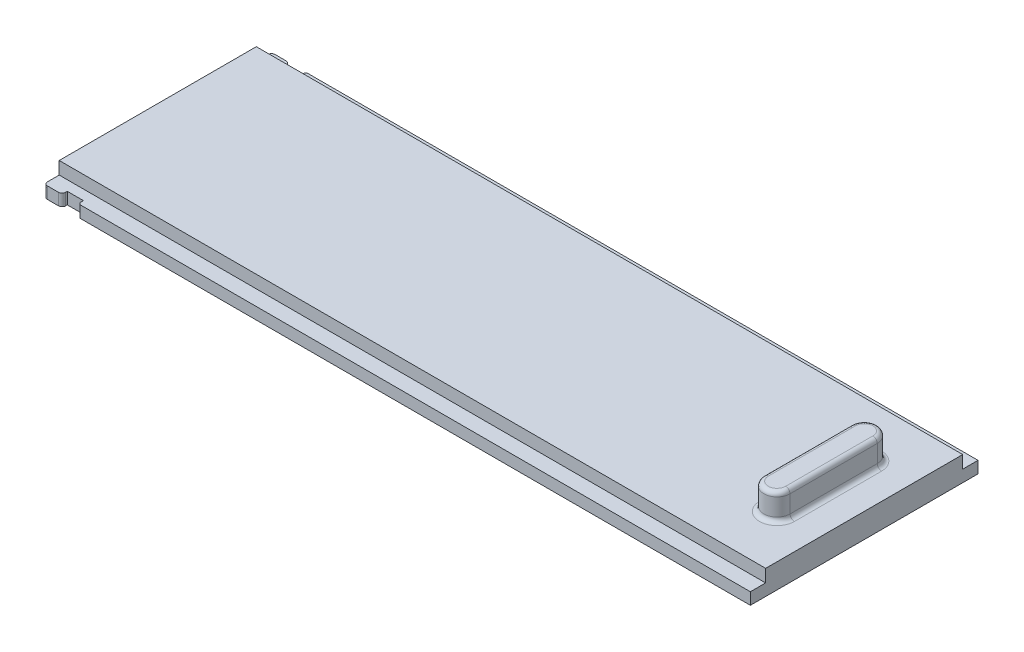
ISO-10303-21;
HEADER;
FILE_DESCRIPTION(('STEP AP214'),'2;1');
FILE_NAME('part.step','',(''),(''),'','','');
FILE_SCHEMA(('AUTOMOTIVE_DESIGN { 1 0 10303 214 1 1 1 1 }'));
ENDSEC;
DATA;
#1=APPLICATION_CONTEXT('core data for automotive mechanical design processes');
#2=APPLICATION_PROTOCOL_DEFINITION('international standard','automotive_design',2000,#1);
#3=PRODUCT_CONTEXT('',#1,'mechanical');
#4=PRODUCT('Part','Part','',(#3));
#5=PRODUCT_RELATED_PRODUCT_CATEGORY('part','',(#4));
#6=PRODUCT_DEFINITION_FORMATION('','',#4);
#7=PRODUCT_DEFINITION_CONTEXT('part definition',#1,'design');
#8=PRODUCT_DEFINITION('design','',#6,#7);
#9=PRODUCT_DEFINITION_SHAPE('','',#8);
#10=(LENGTH_UNIT() NAMED_UNIT(*) SI_UNIT(.MILLI.,.METRE.));
#11=(NAMED_UNIT(*) PLANE_ANGLE_UNIT() SI_UNIT($,.RADIAN.));
#12=(NAMED_UNIT(*) SI_UNIT($,.STERADIAN.) SOLID_ANGLE_UNIT());
#13=UNCERTAINTY_MEASURE_WITH_UNIT(LENGTH_MEASURE(1.E-05),#10,'distance_accuracy_value','');
#14=(GEOMETRIC_REPRESENTATION_CONTEXT(3) GLOBAL_UNCERTAINTY_ASSIGNED_CONTEXT((#13)) GLOBAL_UNIT_ASSIGNED_CONTEXT((#10,
#11,#12)) REPRESENTATION_CONTEXT('',''));
#15=CARTESIAN_POINT('',(0.,0.,0.));
#16=DIRECTION('',(0.,0.,1.));
#17=DIRECTION('',(1.,0.,0.));
#18=AXIS2_PLACEMENT_3D('',#15,#16,#17);
#19=CARTESIAN_POINT('',(0.,3.,0.));
#20=DIRECTION('',(0.,-1.,0.));
#21=DIRECTION('',(0.,0.,-1.));
#22=AXIS2_PLACEMENT_3D('',#19,#20,#21);
#23=PLANE('',#22);
#24=CARTESIAN_POINT('',(76.,3.,-9.49999999999999));
#25=DIRECTION('',(0.,-1.,0.));
#26=DIRECTION('',(0.,0.,-1.));
#27=AXIS2_PLACEMENT_3D('',#24,#25,#26);
#28=CIRCLE('',#27,2.);
#29=CARTESIAN_POINT('',(78.,3.,-9.49999999999999));
#30=VERTEX_POINT('',#29);
#31=CARTESIAN_POINT('',(74.,3.,-9.49999999999999));
#32=VERTEX_POINT('',#31);
#33=EDGE_CURVE('E388',#30,#32,#28,.T.);
#34=ORIENTED_EDGE('',*,*,#33,.T.);
#35=DIRECTION('',(0.,0.,1.));
#36=VECTOR('',#35,1.);
#37=CARTESIAN_POINT('',(74.,3.,-19.5));
#38=LINE('',#37,#36);
#39=CARTESIAN_POINT('',(74.,3.,-19.5));
#40=VERTEX_POINT('',#39);
#41=EDGE_CURVE('E394',#32,#40,#38,.F.);
#42=ORIENTED_EDGE('',*,*,#41,.T.);
#43=CARTESIAN_POINT('',(76.,3.,-19.5));
#44=DIRECTION('',(0.,-1.,0.));
#45=DIRECTION('',(0.,0.,-1.));
#46=AXIS2_PLACEMENT_3D('',#43,#44,#45);
#47=CIRCLE('',#46,2.);
#48=CARTESIAN_POINT('',(78.,3.,-19.5));
#49=VERTEX_POINT('',#48);
#50=EDGE_CURVE('E392',#40,#49,#47,.T.);
#51=ORIENTED_EDGE('',*,*,#50,.T.);
#52=DIRECTION('',(0.,0.,-1.));
#53=VECTOR('',#52,1.);
#54=CARTESIAN_POINT('',(78.,3.,-9.49999999999999));
#55=LINE('',#54,#53);
#56=EDGE_CURVE('E390',#49,#30,#55,.F.);
#57=ORIENTED_EDGE('',*,*,#56,.T.);
#58=EDGE_LOOP('',(#34,#42,#51,#57));
#59=FACE_BOUND('',#58,.T.);
#60=DIRECTION('',(0.,0.,-1.));
#61=VECTOR('',#60,1.);
#62=CARTESIAN_POINT('',(81.,3.,0.));
#63=LINE('',#62,#61);
#64=CARTESIAN_POINT('',(81.,3.,-3.2));
#65=VERTEX_POINT('',#64);
#66=CARTESIAN_POINT('',(81.,3.,-25.8));
#67=VERTEX_POINT('',#66);
#68=EDGE_CURVE('E303',#65,#67,#63,.T.);
#69=ORIENTED_EDGE('',*,*,#68,.T.);
#70=DIRECTION('',(1.,0.,0.));
#71=VECTOR('',#70,1.);
#72=CARTESIAN_POINT('',(-3.57805813256297,3.,-25.8));
#73=LINE('',#72,#71);
#74=CARTESIAN_POINT('',(0.,3.,-25.8));
#75=VERTEX_POINT('',#74);
#76=EDGE_CURVE('E267',#75,#67,#73,.T.);
#77=ORIENTED_EDGE('',*,*,#76,.F.);
#78=DIRECTION('',(0.,0.,1.));
#79=VECTOR('',#78,1.);
#80=CARTESIAN_POINT('',(0.,3.,0.));
#81=LINE('',#80,#79);
#82=CARTESIAN_POINT('',(0.,3.,-3.2));
#83=VERTEX_POINT('',#82);
#84=EDGE_CURVE('E300',#75,#83,#81,.T.);
#85=ORIENTED_EDGE('',*,*,#84,.T.);
#86=DIRECTION('',(1.,0.,0.));
#87=VECTOR('',#86,1.);
#88=CARTESIAN_POINT('',(-3.57805813256297,3.,-3.2));
#89=LINE('',#88,#87);
#90=EDGE_CURVE('E286',#83,#65,#89,.T.);
#91=ORIENTED_EDGE('',*,*,#90,.T.);
#92=EDGE_LOOP('',(#69,#77,#85,#91));
#93=FACE_BOUND('',#92,.T.);
#94=ADVANCED_FACE('F41',(#59,#93),#23,.F.);
#95=CARTESIAN_POINT('',(-3.57805813256297,0.,-27.55));
#96=DIRECTION('',(0.,0.,1.));
#97=DIRECTION('',(1.,0.,0.));
#98=AXIS2_PLACEMENT_3D('',#95,#96,#97);
#99=PLANE('',#98);
#100=DIRECTION('',(0.,-1.,0.));
#101=VECTOR('',#100,1.);
#102=CARTESIAN_POINT('',(81.,0.,-27.55));
#103=LINE('',#102,#101);
#104=CARTESIAN_POINT('',(81.,1.55,-27.55));
#105=VERTEX_POINT('',#104);
#106=CARTESIAN_POINT('',(81.,0.2,-27.55));
#107=VERTEX_POINT('',#106);
#108=EDGE_CURVE('E258',#105,#107,#103,.T.);
#109=ORIENTED_EDGE('',*,*,#108,.T.);
#110=DIRECTION('',(1.,0.,0.));
#111=VECTOR('',#110,1.);
#112=CARTESIAN_POINT('',(0.,0.2,-27.55));
#113=LINE('',#112,#111);
#114=CARTESIAN_POINT('',(4.125,0.2,-27.55));
#115=VERTEX_POINT('',#114);
#116=EDGE_CURVE('E239',#115,#107,#113,.T.);
#117=ORIENTED_EDGE('',*,*,#116,.F.);
#118=DIRECTION('',(0.,1.,0.));
#119=VECTOR('',#118,1.);
#120=CARTESIAN_POINT('',(4.125,0.,-27.55));
#121=LINE('',#120,#119);
#122=CARTESIAN_POINT('',(4.125,1.55,-27.55));
#123=VERTEX_POINT('',#122);
#124=EDGE_CURVE('E333',#115,#123,#121,.T.);
#125=ORIENTED_EDGE('',*,*,#124,.T.);
#126=DIRECTION('',(1.,0.,0.));
#127=VECTOR('',#126,1.);
#128=CARTESIAN_POINT('',(-3.57805813256297,1.55,-27.55));
#129=LINE('',#128,#127);
#130=EDGE_CURVE('E265',#123,#105,#129,.T.);
#131=ORIENTED_EDGE('',*,*,#130,.T.);
#132=EDGE_LOOP('',(#109,#117,#125,#131));
#133=FACE_BOUND('',#132,.T.);
#134=ADVANCED_FACE('F263',(#133),#99,.F.);
#135=CARTESIAN_POINT('',(-3.57805813256297,0.,-1.45));
#136=DIRECTION('',(0.,0.,-1.));
#137=DIRECTION('',(0.,1.,0.));
#138=AXIS2_PLACEMENT_3D('',#135,#136,#137);
#139=PLANE('',#138);
#140=DIRECTION('',(0.,-1.,0.));
#141=VECTOR('',#140,1.);
#142=CARTESIAN_POINT('',(4.12500000000001,0.,-1.45));
#143=LINE('',#142,#141);
#144=CARTESIAN_POINT('',(4.12500000000001,1.55,-1.45));
#145=VERTEX_POINT('',#144);
#146=CARTESIAN_POINT('',(4.12500000000001,0.2,-1.45));
#147=VERTEX_POINT('',#146);
#148=EDGE_CURVE('E319',#145,#147,#143,.T.);
#149=ORIENTED_EDGE('',*,*,#148,.T.);
#150=DIRECTION('',(-1.,0.,0.));
#151=VECTOR('',#150,1.);
#152=CARTESIAN_POINT('',(0.,0.2,-1.45));
#153=LINE('',#152,#151);
#154=CARTESIAN_POINT('',(81.,0.2,-1.45));
#155=VERTEX_POINT('',#154);
#156=EDGE_CURVE('E442',#155,#147,#153,.T.);
#157=ORIENTED_EDGE('',*,*,#156,.F.);
#158=DIRECTION('',(0.,1.,0.));
#159=VECTOR('',#158,1.);
#160=CARTESIAN_POINT('',(81.,0.,-1.45));
#161=LINE('',#160,#159);
#162=CARTESIAN_POINT('',(81.,1.55,-1.45));
#163=VERTEX_POINT('',#162);
#164=EDGE_CURVE('E260',#155,#163,#161,.T.);
#165=ORIENTED_EDGE('',*,*,#164,.T.);
#166=DIRECTION('',(1.,0.,0.));
#167=VECTOR('',#166,1.);
#168=CARTESIAN_POINT('',(-3.57805813256297,1.55,-1.45));
#169=LINE('',#168,#167);
#170=EDGE_CURVE('E283',#145,#163,#169,.T.);
#171=ORIENTED_EDGE('',*,*,#170,.F.);
#172=EDGE_LOOP('',(#149,#157,#165,#171));
#173=FACE_BOUND('',#172,.T.);
#174=ADVANCED_FACE('F558',(#173),#139,.F.);
#175=CARTESIAN_POINT('',(0.,3.,0.));
#176=DIRECTION('',(1.,0.,0.));
#177=DIRECTION('',(0.,0.,-1.));
#178=AXIS2_PLACEMENT_3D('',#175,#176,#177);
#179=PLANE('',#178);
#180=DIRECTION('',(0.,0.,1.));
#181=VECTOR('',#180,1.);
#182=CARTESIAN_POINT('',(0.,1.55,-27.55));
#183=LINE('',#182,#181);
#184=CARTESIAN_POINT('',(0.,1.55,-27.15));
#185=VERTEX_POINT('',#184);
#186=CARTESIAN_POINT('',(0.,1.55,-25.8));
#187=VERTEX_POINT('',#186);
#188=EDGE_CURVE('E304',#185,#187,#183,.T.);
#189=ORIENTED_EDGE('',*,*,#188,.F.);
#190=DIRECTION('',(0.,1.,0.));
#191=VECTOR('',#190,1.);
#192=CARTESIAN_POINT('',(0.,3.,-27.15));
#193=LINE('',#192,#191);
#194=CARTESIAN_POINT('',(0.,0.2,-27.15));
#195=VERTEX_POINT('',#194);
#196=EDGE_CURVE('E345',#185,#195,#193,.F.);
#197=ORIENTED_EDGE('',*,*,#196,.T.);
#198=DIRECTION('',(0.,0.,-1.));
#199=VECTOR('',#198,1.);
#200=CARTESIAN_POINT('',(0.,0.2,-27.55));
#201=LINE('',#200,#199);
#202=CARTESIAN_POINT('',(0.,0.2,-1.85000000000001));
#203=VERTEX_POINT('',#202);
#204=EDGE_CURVE('E251',#203,#195,#201,.T.);
#205=ORIENTED_EDGE('',*,*,#204,.F.);
#206=DIRECTION('',(0.,-1.,0.));
#207=VECTOR('',#206,1.);
#208=CARTESIAN_POINT('',(0.,3.,-1.85));
#209=LINE('',#208,#207);
#210=CARTESIAN_POINT('',(0.,1.55,-1.85));
#211=VERTEX_POINT('',#210);
#212=EDGE_CURVE('E343',#203,#211,#209,.F.);
#213=ORIENTED_EDGE('',*,*,#212,.T.);
#214=DIRECTION('',(0.,0.,1.));
#215=VECTOR('',#214,1.);
#216=CARTESIAN_POINT('',(0.,1.55,-1.45));
#217=LINE('',#216,#215);
#218=CARTESIAN_POINT('',(0.,1.55,-3.2));
#219=VERTEX_POINT('',#218);
#220=EDGE_CURVE('E289',#219,#211,#217,.T.);
#221=ORIENTED_EDGE('',*,*,#220,.F.);
#222=DIRECTION('',(0.,-1.,0.));
#223=VECTOR('',#222,1.);
#224=CARTESIAN_POINT('',(0.,1.55,-3.2));
#225=LINE('',#224,#223);
#226=EDGE_CURVE('E295',#83,#219,#225,.T.);
#227=ORIENTED_EDGE('',*,*,#226,.F.);
#228=ORIENTED_EDGE('',*,*,#84,.F.);
#229=DIRECTION('',(0.,1.,0.));
#230=VECTOR('',#229,1.);
#231=CARTESIAN_POINT('',(0.,1.55,-25.8));
#232=LINE('',#231,#230);
#233=EDGE_CURVE('E278',#187,#75,#232,.T.);
#234=ORIENTED_EDGE('',*,*,#233,.F.);
#235=EDGE_LOOP('',(#189,#197,#205,#213,#221,#227,#228,#234));
#236=FACE_BOUND('',#235,.T.);
#237=ADVANCED_FACE('F511',(#236),#179,.F.);
#238=CARTESIAN_POINT('',(81.,3.,0.));
#239=DIRECTION('',(-1.,0.,0.));
#240=DIRECTION('',(0.,0.,1.));
#241=AXIS2_PLACEMENT_3D('',#238,#239,#240);
#242=PLANE('',#241);
#243=ORIENTED_EDGE('',*,*,#164,.F.);
#244=DIRECTION('',(0.,0.,1.));
#245=VECTOR('',#244,1.);
#246=CARTESIAN_POINT('',(81.,0.2,-27.55));
#247=LINE('',#246,#245);
#248=EDGE_CURVE('E243',#107,#155,#247,.T.);
#249=ORIENTED_EDGE('',*,*,#248,.F.);
#250=ORIENTED_EDGE('',*,*,#108,.F.);
#251=DIRECTION('',(0.,0.,-1.));
#252=VECTOR('',#251,1.);
#253=CARTESIAN_POINT('',(81.,1.55,-27.55));
#254=LINE('',#253,#252);
#255=CARTESIAN_POINT('',(81.,1.55,-25.8));
#256=VERTEX_POINT('',#255);
#257=EDGE_CURVE('E268',#256,#105,#254,.T.);
#258=ORIENTED_EDGE('',*,*,#257,.F.);
#259=DIRECTION('',(0.,-1.,0.));
#260=VECTOR('',#259,1.);
#261=CARTESIAN_POINT('',(81.,1.55,-25.8));
#262=LINE('',#261,#260);
#263=EDGE_CURVE('E272',#67,#256,#262,.T.);
#264=ORIENTED_EDGE('',*,*,#263,.F.);
#265=ORIENTED_EDGE('',*,*,#68,.F.);
#266=DIRECTION('',(0.,1.,0.));
#267=VECTOR('',#266,1.);
#268=CARTESIAN_POINT('',(81.,1.55,-3.2));
#269=LINE('',#268,#267);
#270=CARTESIAN_POINT('',(81.,1.55,-3.2));
#271=VERTEX_POINT('',#270);
#272=EDGE_CURVE('E282',#271,#65,#269,.T.);
#273=ORIENTED_EDGE('',*,*,#272,.F.);
#274=DIRECTION('',(0.,0.,-1.));
#275=VECTOR('',#274,1.);
#276=CARTESIAN_POINT('',(81.,1.55,-1.45));
#277=LINE('',#276,#275);
#278=EDGE_CURVE('E291',#163,#271,#277,.T.);
#279=ORIENTED_EDGE('',*,*,#278,.F.);
#280=EDGE_LOOP('',(#243,#249,#250,#258,#264,#265,#273,#279));
#281=FACE_BOUND('',#280,.T.);
#282=ADVANCED_FACE('F256',(#281),#242,.F.);
#283=CARTESIAN_POINT('',(-3.57805813256297,1.55,-3.2));
#284=DIRECTION('',(0.,0.,-1.));
#285=DIRECTION('',(0.,1.,0.));
#286=AXIS2_PLACEMENT_3D('',#283,#284,#285);
#287=PLANE('',#286);
#288=ORIENTED_EDGE('',*,*,#226,.T.);
#289=DIRECTION('',(1.,0.,0.));
#290=VECTOR('',#289,1.);
#291=CARTESIAN_POINT('',(-3.57805813256297,1.55,-3.2));
#292=LINE('',#291,#290);
#293=EDGE_CURVE('E284',#219,#271,#292,.T.);
#294=ORIENTED_EDGE('',*,*,#293,.T.);
#295=ORIENTED_EDGE('',*,*,#272,.T.);
#296=ORIENTED_EDGE('',*,*,#90,.F.);
#297=EDGE_LOOP('',(#288,#294,#295,#296));
#298=FACE_BOUND('',#297,.T.);
#299=ADVANCED_FACE('F562',(#298),#287,.F.);
#300=CARTESIAN_POINT('',(-3.57805813256297,1.55,-1.45));
#301=DIRECTION('',(0.,-1.,0.));
#302=DIRECTION('',(0.,0.,-1.));
#303=AXIS2_PLACEMENT_3D('',#300,#301,#302);
#304=PLANE('',#303);
#305=ORIENTED_EDGE('',*,*,#220,.T.);
#306=CARTESIAN_POINT('',(0.4,1.55,-1.85));
#307=DIRECTION('',(0.,-1.,0.));
#308=DIRECTION('',(0.,0.,-1.));
#309=AXIS2_PLACEMENT_3D('',#306,#307,#308);
#310=CIRCLE('',#309,0.4);
#311=CARTESIAN_POINT('',(0.4,1.55,-1.45));
#312=VERTEX_POINT('',#311);
#313=EDGE_CURVE('E354',#211,#312,#310,.F.);
#314=ORIENTED_EDGE('',*,*,#313,.T.);
#315=CARTESIAN_POINT('',(1.675,1.55,-1.45));
#316=VERTEX_POINT('',#315);
#317=EDGE_CURVE('E280',#312,#316,#169,.T.);
#318=ORIENTED_EDGE('',*,*,#317,.T.);
#319=CARTESIAN_POINT('',(1.675,1.55,-1.85));
#320=DIRECTION('',(0.,-1.,0.));
#321=DIRECTION('',(0.,0.,-1.));
#322=AXIS2_PLACEMENT_3D('',#319,#320,#321);
#323=CIRCLE('',#322,0.4);
#324=CARTESIAN_POINT('',(2.075,1.55,-1.85));
#325=VERTEX_POINT('',#324);
#326=EDGE_CURVE('E313',#316,#325,#323,.F.);
#327=ORIENTED_EDGE('',*,*,#326,.T.);
#328=DIRECTION('',(0.,0.,1.));
#329=VECTOR('',#328,1.);
#330=CARTESIAN_POINT('',(2.075,1.55,-2.05));
#331=LINE('',#330,#329);
#332=CARTESIAN_POINT('',(2.075,1.55,-2.05));
#333=VERTEX_POINT('',#332);
#334=EDGE_CURVE('E297',#333,#325,#331,.T.);
#335=ORIENTED_EDGE('',*,*,#334,.F.);
#336=DIRECTION('',(-1.,0.,0.));
#337=VECTOR('',#336,1.);
#338=CARTESIAN_POINT('',(2.075,1.55,-2.05));
#339=LINE('',#338,#337);
#340=CARTESIAN_POINT('',(3.925,1.55,-2.05));
#341=VERTEX_POINT('',#340);
#342=EDGE_CURVE('E484',#341,#333,#339,.T.);
#343=ORIENTED_EDGE('',*,*,#342,.F.);
#344=DIRECTION('',(0.,0.,1.));
#345=VECTOR('',#344,1.);
#346=CARTESIAN_POINT('',(3.925,1.55,-2.05));
#347=LINE('',#346,#345);
#348=CARTESIAN_POINT('',(3.925,1.55,-1.65000000000001));
#349=VERTEX_POINT('',#348);
#350=EDGE_CURVE('E490',#341,#349,#347,.T.);
#351=ORIENTED_EDGE('',*,*,#350,.T.);
#352=DIRECTION('',(-0.707106781186548,0.,-0.707106781186548));
#353=VECTOR('',#352,1.);
#354=CARTESIAN_POINT('',(3.925,1.55,-1.65000000000001));
#355=LINE('',#354,#353);
#356=EDGE_CURVE('E317',#349,#145,#355,.F.);
#357=ORIENTED_EDGE('',*,*,#356,.T.);
#358=ORIENTED_EDGE('',*,*,#170,.T.);
#359=ORIENTED_EDGE('',*,*,#278,.T.);
#360=ORIENTED_EDGE('',*,*,#293,.F.);
#361=EDGE_LOOP('',(#305,#314,#318,#327,#335,#343,#351,#357,#358,#359,#360));
#362=FACE_BOUND('',#361,.T.);
#363=ADVANCED_FACE('F590',(#362),#304,.F.);
#364=ORIENTED_EDGE('',*,*,#317,.F.);
#365=DIRECTION('',(0.,-1.,0.));
#366=VECTOR('',#365,1.);
#367=CARTESIAN_POINT('',(0.4,0.,-1.45));
#368=LINE('',#367,#366);
#369=CARTESIAN_POINT('',(0.4,0.2,-1.45));
#370=VERTEX_POINT('',#369);
#371=EDGE_CURVE('E351',#312,#370,#368,.T.);
#372=ORIENTED_EDGE('',*,*,#371,.T.);
#373=CARTESIAN_POINT('',(1.675,0.2,-1.45));
#374=VERTEX_POINT('',#373);
#375=EDGE_CURVE('E261',#374,#370,#153,.T.);
#376=ORIENTED_EDGE('',*,*,#375,.F.);
#377=DIRECTION('',(0.,-1.,0.));
#378=VECTOR('',#377,1.);
#379=CARTESIAN_POINT('',(1.675,0.,-1.45));
#380=LINE('',#379,#378);
#381=EDGE_CURVE('E310',#374,#316,#380,.F.);
#382=ORIENTED_EDGE('',*,*,#381,.T.);
#383=EDGE_LOOP('',(#364,#372,#376,#382));
#384=FACE_BOUND('',#383,.T.);
#385=ADVANCED_FACE('F605',(#384),#139,.F.);
#386=CARTESIAN_POINT('',(0.4,0.2,-27.55));
#387=VERTEX_POINT('',#386);
#388=CARTESIAN_POINT('',(1.675,0.2,-27.55));
#389=VERTEX_POINT('',#388);
#390=EDGE_CURVE('E250',#387,#389,#113,.T.);
#391=ORIENTED_EDGE('',*,*,#390,.F.);
#392=DIRECTION('',(0.,1.,0.));
#393=VECTOR('',#392,1.);
#394=CARTESIAN_POINT('',(0.4,0.,-27.55));
#395=LINE('',#394,#393);
#396=CARTESIAN_POINT('',(0.4,1.55,-27.55));
#397=VERTEX_POINT('',#396);
#398=EDGE_CURVE('E338',#387,#397,#395,.T.);
#399=ORIENTED_EDGE('',*,*,#398,.T.);
#400=CARTESIAN_POINT('',(1.675,1.55,-27.55));
#401=VERTEX_POINT('',#400);
#402=EDGE_CURVE('E276',#397,#401,#129,.T.);
#403=ORIENTED_EDGE('',*,*,#402,.T.);
#404=DIRECTION('',(0.,1.,0.));
#405=VECTOR('',#404,1.);
#406=CARTESIAN_POINT('',(1.675,0.,-27.55));
#407=LINE('',#406,#405);
#408=EDGE_CURVE('E327',#401,#389,#407,.F.);
#409=ORIENTED_EDGE('',*,*,#408,.T.);
#410=EDGE_LOOP('',(#391,#399,#403,#409));
#411=FACE_BOUND('',#410,.T.);
#412=ADVANCED_FACE('F521',(#411),#99,.F.);
#413=CARTESIAN_POINT('',(-3.57805813256297,1.55,-27.55));
#414=DIRECTION('',(0.,-1.,0.));
#415=DIRECTION('',(0.,0.,-1.));
#416=AXIS2_PLACEMENT_3D('',#413,#414,#415);
#417=PLANE('',#416);
#418=ORIENTED_EDGE('',*,*,#402,.F.);
#419=CARTESIAN_POINT('',(0.4,1.55,-27.15));
#420=DIRECTION('',(0.,-1.,0.));
#421=DIRECTION('',(0.,0.,-1.));
#422=AXIS2_PLACEMENT_3D('',#419,#420,#421);
#423=CIRCLE('',#422,0.4);
#424=EDGE_CURVE('E341',#397,#185,#423,.F.);
#425=ORIENTED_EDGE('',*,*,#424,.T.);
#426=ORIENTED_EDGE('',*,*,#188,.T.);
#427=DIRECTION('',(1.,0.,0.));
#428=VECTOR('',#427,1.);
#429=CARTESIAN_POINT('',(-3.57805813256297,1.55,-25.8));
#430=LINE('',#429,#428);
#431=EDGE_CURVE('E270',#187,#256,#430,.T.);
#432=ORIENTED_EDGE('',*,*,#431,.T.);
#433=ORIENTED_EDGE('',*,*,#257,.T.);
#434=ORIENTED_EDGE('',*,*,#130,.F.);
#435=DIRECTION('',(0.707106781186548,0.,-0.707106781186548));
#436=VECTOR('',#435,1.);
#437=CARTESIAN_POINT('',(3.925,1.55,-27.35));
#438=LINE('',#437,#436);
#439=CARTESIAN_POINT('',(3.925,1.55,-27.35));
#440=VERTEX_POINT('',#439);
#441=EDGE_CURVE('E335',#123,#440,#438,.F.);
#442=ORIENTED_EDGE('',*,*,#441,.T.);
#443=DIRECTION('',(0.,0.,-1.));
#444=VECTOR('',#443,1.);
#445=CARTESIAN_POINT('',(3.925,1.55,-26.95));
#446=LINE('',#445,#444);
#447=CARTESIAN_POINT('',(3.925,1.55,-26.95));
#448=VERTEX_POINT('',#447);
#449=EDGE_CURVE('E477',#448,#440,#446,.T.);
#450=ORIENTED_EDGE('',*,*,#449,.F.);
#451=DIRECTION('',(1.,0.,0.));
#452=VECTOR('',#451,1.);
#453=CARTESIAN_POINT('',(2.075,1.55,-26.95));
#454=LINE('',#453,#452);
#455=CARTESIAN_POINT('',(2.075,1.55,-26.95));
#456=VERTEX_POINT('',#455);
#457=EDGE_CURVE('E473',#456,#448,#454,.T.);
#458=ORIENTED_EDGE('',*,*,#457,.F.);
#459=DIRECTION('',(0.,0.,-1.));
#460=VECTOR('',#459,1.);
#461=CARTESIAN_POINT('',(2.075,1.55,-26.95));
#462=LINE('',#461,#460);
#463=CARTESIAN_POINT('',(2.075,1.55,-27.15));
#464=VERTEX_POINT('',#463);
#465=EDGE_CURVE('E476',#456,#464,#462,.T.);
#466=ORIENTED_EDGE('',*,*,#465,.T.);
#467=CARTESIAN_POINT('',(1.675,1.55,-27.15));
#468=DIRECTION('',(0.,-1.,0.));
#469=DIRECTION('',(0.,0.,-1.));
#470=AXIS2_PLACEMENT_3D('',#467,#468,#469);
#471=CIRCLE('',#470,0.4);
#472=EDGE_CURVE('E324',#464,#401,#471,.F.);
#473=ORIENTED_EDGE('',*,*,#472,.T.);
#474=EDGE_LOOP('',(#418,#425,#426,#432,#433,#434,#442,#450,#458,#466,#473));
#475=FACE_BOUND('',#474,.T.);
#476=ADVANCED_FACE('F506',(#475),#417,.F.);
#477=CARTESIAN_POINT('',(-3.57805813256297,1.55,-25.8));
#478=DIRECTION('',(0.,0.,1.));
#479=DIRECTION('',(0.,-1.,0.));
#480=AXIS2_PLACEMENT_3D('',#477,#478,#479);
#481=PLANE('',#480);
#482=ORIENTED_EDGE('',*,*,#233,.T.);
#483=ORIENTED_EDGE('',*,*,#76,.T.);
#484=ORIENTED_EDGE('',*,*,#263,.T.);
#485=ORIENTED_EDGE('',*,*,#431,.F.);
#486=EDGE_LOOP('',(#482,#483,#484,#485));
#487=FACE_BOUND('',#486,.T.);
#488=ADVANCED_FACE('F500',(#487),#481,.F.);
#489=CARTESIAN_POINT('',(3.925,0.,-2.05));
#490=DIRECTION('',(1.,0.,0.));
#491=DIRECTION('',(0.,0.,-1.));
#492=AXIS2_PLACEMENT_3D('',#489,#490,#491);
#493=PLANE('',#492);
#494=DIRECTION('',(0.,1.,0.));
#495=VECTOR('',#494,1.);
#496=CARTESIAN_POINT('',(3.925,0.,-2.05));
#497=LINE('',#496,#495);
#498=CARTESIAN_POINT('',(3.925,0.2,-2.05));
#499=VERTEX_POINT('',#498);
#500=EDGE_CURVE('E480',#499,#341,#497,.T.);
#501=ORIENTED_EDGE('',*,*,#500,.F.);
#502=DIRECTION('',(0.,0.,1.));
#503=VECTOR('',#502,1.);
#504=CARTESIAN_POINT('',(3.925,0.2,-2.05));
#505=LINE('',#504,#503);
#506=CARTESIAN_POINT('',(3.925,0.2,-1.65000000000001));
#507=VERTEX_POINT('',#506);
#508=EDGE_CURVE('E457',#499,#507,#505,.T.);
#509=ORIENTED_EDGE('',*,*,#508,.T.);
#510=DIRECTION('',(0.,1.,0.));
#511=VECTOR('',#510,1.);
#512=CARTESIAN_POINT('',(3.925,0.,-1.65000000000001));
#513=LINE('',#512,#511);
#514=EDGE_CURVE('E315',#507,#349,#513,.T.);
#515=ORIENTED_EDGE('',*,*,#514,.T.);
#516=ORIENTED_EDGE('',*,*,#350,.F.);
#517=EDGE_LOOP('',(#501,#509,#515,#516));
#518=FACE_BOUND('',#517,.T.);
#519=ADVANCED_FACE('F618',(#518),#493,.F.);
#520=CARTESIAN_POINT('',(2.075,0.,-2.05));
#521=DIRECTION('',(-1.,0.,0.));
#522=DIRECTION('',(0.,0.,1.));
#523=AXIS2_PLACEMENT_3D('',#520,#521,#522);
#524=PLANE('',#523);
#525=DIRECTION('',(0.,-1.,0.));
#526=VECTOR('',#525,1.);
#527=CARTESIAN_POINT('',(2.075,0.,-1.85));
#528=LINE('',#527,#526);
#529=CARTESIAN_POINT('',(2.075,0.2,-1.85));
#530=VERTEX_POINT('',#529);
#531=EDGE_CURVE('E307',#325,#530,#528,.T.);
#532=ORIENTED_EDGE('',*,*,#531,.T.);
#533=DIRECTION('',(0.,0.,-1.));
#534=VECTOR('',#533,1.);
#535=CARTESIAN_POINT('',(2.075,0.2,-2.05));
#536=LINE('',#535,#534);
#537=CARTESIAN_POINT('',(2.075,0.2,-2.05));
#538=VERTEX_POINT('',#537);
#539=EDGE_CURVE('E463',#530,#538,#536,.T.);
#540=ORIENTED_EDGE('',*,*,#539,.T.);
#541=DIRECTION('',(0.,-1.,0.));
#542=VECTOR('',#541,1.);
#543=CARTESIAN_POINT('',(2.075,0.,-2.05));
#544=LINE('',#543,#542);
#545=EDGE_CURVE('E487',#333,#538,#544,.T.);
#546=ORIENTED_EDGE('',*,*,#545,.F.);
#547=ORIENTED_EDGE('',*,*,#334,.T.);
#548=EDGE_LOOP('',(#532,#540,#546,#547));
#549=FACE_BOUND('',#548,.T.);
#550=ADVANCED_FACE('F611',(#549),#524,.F.);
#551=CARTESIAN_POINT('',(0.,0.,-2.05));
#552=DIRECTION('',(0.,0.,-1.));
#553=DIRECTION('',(-1.,0.,0.));
#554=AXIS2_PLACEMENT_3D('',#551,#552,#553);
#555=PLANE('',#554);
#556=ORIENTED_EDGE('',*,*,#545,.T.);
#557=DIRECTION('',(1.,0.,0.));
#558=VECTOR('',#557,1.);
#559=CARTESIAN_POINT('',(0.,0.2,-2.05));
#560=LINE('',#559,#558);
#561=EDGE_CURVE('E460',#538,#499,#560,.T.);
#562=ORIENTED_EDGE('',*,*,#561,.T.);
#563=ORIENTED_EDGE('',*,*,#500,.T.);
#564=ORIENTED_EDGE('',*,*,#342,.T.);
#565=EDGE_LOOP('',(#556,#562,#563,#564));
#566=FACE_BOUND('',#565,.T.);
#567=ADVANCED_FACE('F571',(#566),#555,.F.);
#568=CARTESIAN_POINT('',(1.675,0.,-1.85));
#569=DIRECTION('',(0.,-1.,0.));
#570=DIRECTION('',(0.,0.,-1.));
#571=AXIS2_PLACEMENT_3D('',#568,#569,#570);
#572=CYLINDRICAL_SURFACE('',#571,0.4);
#573=CARTESIAN_POINT('',(1.675,0.2,-1.85));
#574=DIRECTION('',(0.,1.,0.));
#575=DIRECTION('',(0.,0.,1.));
#576=AXIS2_PLACEMENT_3D('',#573,#574,#575);
#577=CIRCLE('',#576,0.4);
#578=EDGE_CURVE('E466',#530,#374,#577,.F.);
#579=ORIENTED_EDGE('',*,*,#578,.F.);
#580=ORIENTED_EDGE('',*,*,#531,.F.);
#581=ORIENTED_EDGE('',*,*,#326,.F.);
#582=ORIENTED_EDGE('',*,*,#381,.F.);
#583=EDGE_LOOP('',(#579,#580,#581,#582));
#584=FACE_BOUND('',#583,.T.);
#585=ADVANCED_FACE('F567',(#584),#572,.T.);
#586=CARTESIAN_POINT('',(3.925,0.,-1.65000000000001));
#587=DIRECTION('',(0.707106781186548,0.,-0.707106781186548));
#588=DIRECTION('',(0.,1.,0.));
#589=AXIS2_PLACEMENT_3D('',#586,#587,#588);
#590=PLANE('',#589);
#591=DIRECTION('',(0.707106781186548,0.,0.707106781186548));
#592=VECTOR('',#591,1.);
#593=CARTESIAN_POINT('',(3.925,0.2,-1.65000000000001));
#594=LINE('',#593,#592);
#595=EDGE_CURVE('E455',#147,#507,#594,.F.);
#596=ORIENTED_EDGE('',*,*,#595,.F.);
#597=ORIENTED_EDGE('',*,*,#148,.F.);
#598=ORIENTED_EDGE('',*,*,#356,.F.);
#599=ORIENTED_EDGE('',*,*,#514,.F.);
#600=EDGE_LOOP('',(#596,#597,#598,#599));
#601=FACE_BOUND('',#600,.T.);
#602=ADVANCED_FACE('F570',(#601),#590,.F.);
#603=CARTESIAN_POINT('',(3.925,1.55,-26.95));
#604=DIRECTION('',(1.,0.,0.));
#605=DIRECTION('',(0.,0.,-1.));
#606=AXIS2_PLACEMENT_3D('',#603,#604,#605);
#607=PLANE('',#606);
#608=DIRECTION('',(0.,-1.,0.));
#609=VECTOR('',#608,1.);
#610=CARTESIAN_POINT('',(3.925,1.55,-27.35));
#611=LINE('',#610,#609);
#612=CARTESIAN_POINT('',(3.925,0.2,-27.35));
#613=VERTEX_POINT('',#612);
#614=EDGE_CURVE('E330',#440,#613,#611,.T.);
#615=ORIENTED_EDGE('',*,*,#614,.T.);
#616=DIRECTION('',(0.,0.,1.));
#617=VECTOR('',#616,1.);
#618=CARTESIAN_POINT('',(3.925,0.2,-26.95));
#619=LINE('',#618,#617);
#620=CARTESIAN_POINT('',(3.925,0.2,-26.95));
#621=VERTEX_POINT('',#620);
#622=EDGE_CURVE('E444',#613,#621,#619,.T.);
#623=ORIENTED_EDGE('',*,*,#622,.T.);
#624=DIRECTION('',(0.,-1.,0.));
#625=VECTOR('',#624,1.);
#626=CARTESIAN_POINT('',(3.925,1.55,-26.95));
#627=LINE('',#626,#625);
#628=EDGE_CURVE('E468',#448,#621,#627,.T.);
#629=ORIENTED_EDGE('',*,*,#628,.F.);
#630=ORIENTED_EDGE('',*,*,#449,.T.);
#631=EDGE_LOOP('',(#615,#623,#629,#630));
#632=FACE_BOUND('',#631,.T.);
#633=ADVANCED_FACE('F536',(#632),#607,.F.);
#634=CARTESIAN_POINT('',(2.075,1.55,-26.95));
#635=DIRECTION('',(-1.,0.,0.));
#636=DIRECTION('',(0.,0.,1.));
#637=AXIS2_PLACEMENT_3D('',#634,#635,#636);
#638=PLANE('',#637);
#639=DIRECTION('',(0.,1.,0.));
#640=VECTOR('',#639,1.);
#641=CARTESIAN_POINT('',(2.075,1.55,-26.95));
#642=LINE('',#641,#640);
#643=CARTESIAN_POINT('',(2.075,0.2,-26.95));
#644=VERTEX_POINT('',#643);
#645=EDGE_CURVE('E471',#644,#456,#642,.T.);
#646=ORIENTED_EDGE('',*,*,#645,.F.);
#647=DIRECTION('',(0.,0.,-1.));
#648=VECTOR('',#647,1.);
#649=CARTESIAN_POINT('',(2.075,0.2,-26.95));
#650=LINE('',#649,#648);
#651=CARTESIAN_POINT('',(2.075,0.2,-27.15));
#652=VERTEX_POINT('',#651);
#653=EDGE_CURVE('E450',#644,#652,#650,.T.);
#654=ORIENTED_EDGE('',*,*,#653,.T.);
#655=DIRECTION('',(0.,1.,0.));
#656=VECTOR('',#655,1.);
#657=CARTESIAN_POINT('',(2.075,1.55,-27.15));
#658=LINE('',#657,#656);
#659=EDGE_CURVE('E322',#652,#464,#658,.T.);
#660=ORIENTED_EDGE('',*,*,#659,.T.);
#661=ORIENTED_EDGE('',*,*,#465,.F.);
#662=EDGE_LOOP('',(#646,#654,#660,#661));
#663=FACE_BOUND('',#662,.T.);
#664=ADVANCED_FACE('F529',(#663),#638,.F.);
#665=CARTESIAN_POINT('',(0.,0.,-26.95));
#666=DIRECTION('',(0.,0.,1.));
#667=DIRECTION('',(1.,0.,0.));
#668=AXIS2_PLACEMENT_3D('',#665,#666,#667);
#669=PLANE('',#668);
#670=ORIENTED_EDGE('',*,*,#628,.T.);
#671=DIRECTION('',(-1.,0.,0.));
#672=VECTOR('',#671,1.);
#673=CARTESIAN_POINT('',(0.,0.2,-26.95));
#674=LINE('',#673,#672);
#675=EDGE_CURVE('E447',#621,#644,#674,.T.);
#676=ORIENTED_EDGE('',*,*,#675,.T.);
#677=ORIENTED_EDGE('',*,*,#645,.T.);
#678=ORIENTED_EDGE('',*,*,#457,.T.);
#679=EDGE_LOOP('',(#670,#676,#677,#678));
#680=FACE_BOUND('',#679,.T.);
#681=ADVANCED_FACE('F533',(#680),#669,.F.);
#682=CARTESIAN_POINT('',(1.675,1.55,-27.15));
#683=DIRECTION('',(0.,1.,0.));
#684=DIRECTION('',(0.,0.,1.));
#685=AXIS2_PLACEMENT_3D('',#682,#683,#684);
#686=CYLINDRICAL_SURFACE('',#685,0.4);
#687=CARTESIAN_POINT('',(1.675,0.2,-27.15));
#688=DIRECTION('',(0.,1.,0.));
#689=DIRECTION('',(0.,0.,1.));
#690=AXIS2_PLACEMENT_3D('',#687,#688,#689);
#691=CIRCLE('',#690,0.4);
#692=EDGE_CURVE('E453',#389,#652,#691,.F.);
#693=ORIENTED_EDGE('',*,*,#692,.F.);
#694=ORIENTED_EDGE('',*,*,#408,.F.);
#695=ORIENTED_EDGE('',*,*,#472,.F.);
#696=ORIENTED_EDGE('',*,*,#659,.F.);
#697=EDGE_LOOP('',(#693,#694,#695,#696));
#698=FACE_BOUND('',#697,.T.);
#699=ADVANCED_FACE('F525',(#698),#686,.T.);
#700=CARTESIAN_POINT('',(3.925,1.55,-27.35));
#701=DIRECTION('',(0.707106781186548,0.,0.707106781186548));
#702=DIRECTION('',(0.,-1.,0.));
#703=AXIS2_PLACEMENT_3D('',#700,#701,#702);
#704=PLANE('',#703);
#705=DIRECTION('',(-0.707106781186548,0.,0.707106781186548));
#706=VECTOR('',#705,1.);
#707=CARTESIAN_POINT('',(3.925,0.2,-27.35));
#708=LINE('',#707,#706);
#709=EDGE_CURVE('E246',#613,#115,#708,.F.);
#710=ORIENTED_EDGE('',*,*,#709,.F.);
#711=ORIENTED_EDGE('',*,*,#614,.F.);
#712=ORIENTED_EDGE('',*,*,#441,.F.);
#713=ORIENTED_EDGE('',*,*,#124,.F.);
#714=EDGE_LOOP('',(#710,#711,#712,#713));
#715=FACE_BOUND('',#714,.T.);
#716=ADVANCED_FACE('F539',(#715),#704,.F.);
#717=CARTESIAN_POINT('',(0.,0.2,0.));
#718=DIRECTION('',(0.,1.,0.));
#719=DIRECTION('',(0.,0.,1.));
#720=AXIS2_PLACEMENT_3D('',#717,#718,#719);
#721=PLANE('',#720);
#722=ORIENTED_EDGE('',*,*,#204,.T.);
#723=CARTESIAN_POINT('',(0.4,0.2,-27.15));
#724=DIRECTION('',(0.,1.,0.));
#725=DIRECTION('',(0.,0.,1.));
#726=AXIS2_PLACEMENT_3D('',#723,#724,#725);
#727=CIRCLE('',#726,0.4);
#728=EDGE_CURVE('E349',#195,#387,#727,.F.);
#729=ORIENTED_EDGE('',*,*,#728,.T.);
#730=ORIENTED_EDGE('',*,*,#390,.T.);
#731=ORIENTED_EDGE('',*,*,#692,.T.);
#732=ORIENTED_EDGE('',*,*,#653,.F.);
#733=ORIENTED_EDGE('',*,*,#675,.F.);
#734=ORIENTED_EDGE('',*,*,#622,.F.);
#735=ORIENTED_EDGE('',*,*,#709,.T.);
#736=ORIENTED_EDGE('',*,*,#116,.T.);
#737=ORIENTED_EDGE('',*,*,#248,.T.);
#738=ORIENTED_EDGE('',*,*,#156,.T.);
#739=ORIENTED_EDGE('',*,*,#595,.T.);
#740=ORIENTED_EDGE('',*,*,#508,.F.);
#741=ORIENTED_EDGE('',*,*,#561,.F.);
#742=ORIENTED_EDGE('',*,*,#539,.F.);
#743=ORIENTED_EDGE('',*,*,#578,.T.);
#744=ORIENTED_EDGE('',*,*,#375,.T.);
#745=CARTESIAN_POINT('',(0.4,0.2,-1.85));
#746=DIRECTION('',(0.,1.,0.));
#747=DIRECTION('',(0.,0.,1.));
#748=AXIS2_PLACEMENT_3D('',#745,#746,#747);
#749=CIRCLE('',#748,0.4);
#750=EDGE_CURVE('E347',#370,#203,#749,.F.);
#751=ORIENTED_EDGE('',*,*,#750,.T.);
#752=EDGE_LOOP('',(#722,#729,#730,#731,#732,#733,#734,#735,#736,#737,#738,#739,#740,#741,#742,
#743,#744,#751));
#753=FACE_BOUND('',#752,.T.);
#754=ADVANCED_FACE('F242',(#753),#721,.F.);
#755=CARTESIAN_POINT('',(0.4,0.,-27.15));
#756=DIRECTION('',(0.,1.,0.));
#757=DIRECTION('',(0.,0.,1.));
#758=AXIS2_PLACEMENT_3D('',#755,#756,#757);
#759=CYLINDRICAL_SURFACE('',#758,0.4);
#760=ORIENTED_EDGE('',*,*,#728,.F.);
#761=ORIENTED_EDGE('',*,*,#196,.F.);
#762=ORIENTED_EDGE('',*,*,#424,.F.);
#763=ORIENTED_EDGE('',*,*,#398,.F.);
#764=EDGE_LOOP('',(#760,#761,#762,#763));
#765=FACE_BOUND('',#764,.T.);
#766=ADVANCED_FACE('F516',(#765),#759,.T.);
#767=CARTESIAN_POINT('',(0.4,0.,-1.85));
#768=DIRECTION('',(0.,-1.,0.));
#769=DIRECTION('',(0.,0.,-1.));
#770=AXIS2_PLACEMENT_3D('',#767,#768,#769);
#771=CYLINDRICAL_SURFACE('',#770,0.4);
#772=ORIENTED_EDGE('',*,*,#313,.F.);
#773=ORIENTED_EDGE('',*,*,#212,.F.);
#774=ORIENTED_EDGE('',*,*,#750,.F.);
#775=ORIENTED_EDGE('',*,*,#371,.F.);
#776=EDGE_LOOP('',(#772,#773,#774,#775));
#777=FACE_BOUND('',#776,.T.);
#778=ADVANCED_FACE('F601',(#777),#771,.T.);
#779=CARTESIAN_POINT('',(76.,6.,-9.49999999999999));
#780=DIRECTION('',(0.,-1.,0.));
#781=DIRECTION('',(0.,0.,-1.));
#782=AXIS2_PLACEMENT_3D('',#779,#780,#781);
#783=CYLINDRICAL_SURFACE('',#782,1.5);
#784=DIRECTION('',(0.,-1.,0.));
#785=VECTOR('',#784,1.);
#786=CARTESIAN_POINT('',(74.5,6.,-9.49999999999999));
#787=LINE('',#786,#785);
#788=CARTESIAN_POINT('',(74.5,5.5,-9.49999999999999));
#789=VERTEX_POINT('',#788);
#790=CARTESIAN_POINT('',(74.5,3.5,-9.49999999999999));
#791=VERTEX_POINT('',#790);
#792=EDGE_CURVE('E385',#789,#791,#787,.T.);
#793=ORIENTED_EDGE('',*,*,#792,.T.);
#794=CARTESIAN_POINT('',(76.,3.5,-9.49999999999999));
#795=DIRECTION('',(0.,-1.,0.));
#796=DIRECTION('',(0.,0.,-1.));
#797=AXIS2_PLACEMENT_3D('',#794,#795,#796);
#798=CIRCLE('',#797,1.5);
#799=CARTESIAN_POINT('',(77.5,3.5,-9.49999999999999));
#800=VERTEX_POINT('',#799);
#801=EDGE_CURVE('E11',#791,#800,#798,.F.);
#802=ORIENTED_EDGE('',*,*,#801,.T.);
#803=DIRECTION('',(0.,-1.,0.));
#804=VECTOR('',#803,1.);
#805=CARTESIAN_POINT('',(77.5,6.,-9.49999999999999));
#806=LINE('',#805,#804);
#807=CARTESIAN_POINT('',(77.5,5.5,-9.49999999999999));
#808=VERTEX_POINT('',#807);
#809=EDGE_CURVE('E439',#808,#800,#806,.T.);
#810=ORIENTED_EDGE('',*,*,#809,.F.);
#811=CARTESIAN_POINT('',(76.,5.5,-9.49999999999999));
#812=DIRECTION('',(0.,1.,0.));
#813=DIRECTION('',(0.,0.,1.));
#814=AXIS2_PLACEMENT_3D('',#811,#812,#813);
#815=CIRCLE('',#814,1.5);
#816=EDGE_CURVE('E372',#808,#789,#815,.F.);
#817=ORIENTED_EDGE('',*,*,#816,.T.);
#818=EDGE_LOOP('',(#793,#802,#810,#817));
#819=FACE_BOUND('',#818,.T.);
#820=ADVANCED_FACE('F432',(#819),#783,.T.);
#821=CARTESIAN_POINT('',(77.5,6.,-9.49999999999999));
#822=DIRECTION('',(-1.,0.,0.));
#823=DIRECTION('',(0.,0.,1.));
#824=AXIS2_PLACEMENT_3D('',#821,#822,#823);
#825=PLANE('',#824);
#826=ORIENTED_EDGE('',*,*,#809,.T.);
#827=DIRECTION('',(0.,0.,-1.));
#828=VECTOR('',#827,1.);
#829=CARTESIAN_POINT('',(77.5,3.5,-19.5));
#830=LINE('',#829,#828);
#831=CARTESIAN_POINT('',(77.5,3.5,-19.5));
#832=VERTEX_POINT('',#831);
#833=EDGE_CURVE('E50',#800,#832,#830,.T.);
#834=ORIENTED_EDGE('',*,*,#833,.T.);
#835=DIRECTION('',(0.,-1.,0.));
#836=VECTOR('',#835,1.);
#837=CARTESIAN_POINT('',(77.5,6.,-19.5));
#838=LINE('',#837,#836);
#839=CARTESIAN_POINT('',(77.5,5.5,-19.5));
#840=VERTEX_POINT('',#839);
#841=EDGE_CURVE('E435',#840,#832,#838,.T.);
#842=ORIENTED_EDGE('',*,*,#841,.F.);
#843=DIRECTION('',(0.,0.,-1.));
#844=VECTOR('',#843,1.);
#845=CARTESIAN_POINT('',(77.5,5.5,-9.49999999999999));
#846=LINE('',#845,#844);
#847=EDGE_CURVE('E370',#840,#808,#846,.F.);
#848=ORIENTED_EDGE('',*,*,#847,.T.);
#849=EDGE_LOOP('',(#826,#834,#842,#848));
#850=FACE_BOUND('',#849,.T.);
#851=ADVANCED_FACE('F800',(#850),#825,.F.);
#852=CARTESIAN_POINT('',(76.,6.,-19.5));
#853=DIRECTION('',(0.,-1.,0.));
#854=DIRECTION('',(0.,0.,-1.));
#855=AXIS2_PLACEMENT_3D('',#852,#853,#854);
#856=CYLINDRICAL_SURFACE('',#855,1.5);
#857=ORIENTED_EDGE('',*,*,#841,.T.);
#858=CARTESIAN_POINT('',(76.,3.5,-19.5));
#859=DIRECTION('',(0.,-1.,0.));
#860=DIRECTION('',(0.,0.,-1.));
#861=AXIS2_PLACEMENT_3D('',#858,#859,#860);
#862=CIRCLE('',#861,1.5);
#863=CARTESIAN_POINT('',(74.5,3.5,-19.5));
#864=VERTEX_POINT('',#863);
#865=EDGE_CURVE('E397',#832,#864,#862,.F.);
#866=ORIENTED_EDGE('',*,*,#865,.T.);
#867=DIRECTION('',(0.,-1.,0.));
#868=VECTOR('',#867,1.);
#869=CARTESIAN_POINT('',(74.5,6.,-19.5));
#870=LINE('',#869,#868);
#871=CARTESIAN_POINT('',(74.5,5.5,-19.5));
#872=VERTEX_POINT('',#871);
#873=EDGE_CURVE('E431',#872,#864,#870,.T.);
#874=ORIENTED_EDGE('',*,*,#873,.F.);
#875=CARTESIAN_POINT('',(76.,5.5,-19.5));
#876=DIRECTION('',(0.,1.,0.));
#877=DIRECTION('',(0.,0.,1.));
#878=AXIS2_PLACEMENT_3D('',#875,#876,#877);
#879=CIRCLE('',#878,1.5);
#880=EDGE_CURVE('E368',#872,#840,#879,.F.);
#881=ORIENTED_EDGE('',*,*,#880,.T.);
#882=EDGE_LOOP('',(#857,#866,#874,#881));
#883=FACE_BOUND('',#882,.T.);
#884=ADVANCED_FACE('F792',(#883),#856,.T.);
#885=CARTESIAN_POINT('',(74.5,6.,-9.49999999999999));
#886=DIRECTION('',(1.,0.,0.));
#887=DIRECTION('',(0.,0.,-1.));
#888=AXIS2_PLACEMENT_3D('',#885,#886,#887);
#889=PLANE('',#888);
#890=ORIENTED_EDGE('',*,*,#873,.T.);
#891=DIRECTION('',(0.,0.,1.));
#892=VECTOR('',#891,1.);
#893=CARTESIAN_POINT('',(74.5,3.5,-9.49999999999999));
#894=LINE('',#893,#892);
#895=EDGE_CURVE('E374',#864,#791,#894,.T.);
#896=ORIENTED_EDGE('',*,*,#895,.T.);
#897=ORIENTED_EDGE('',*,*,#792,.F.);
#898=DIRECTION('',(0.,0.,1.));
#899=VECTOR('',#898,1.);
#900=CARTESIAN_POINT('',(74.5,5.5,-19.5));
#901=LINE('',#900,#899);
#902=EDGE_CURVE('E365',#789,#872,#901,.F.);
#903=ORIENTED_EDGE('',*,*,#902,.T.);
#904=EDGE_LOOP('',(#890,#896,#897,#903));
#905=FACE_BOUND('',#904,.T.);
#906=ADVANCED_FACE('F428',(#905),#889,.F.);
#907=CARTESIAN_POINT('',(76.,6.,-9.49999999999999));
#908=DIRECTION('',(0.,1.,0.));
#909=DIRECTION('',(0.,0.,1.));
#910=AXIS2_PLACEMENT_3D('',#907,#908,#909);
#911=PLANE('',#910);
#912=CARTESIAN_POINT('',(76.,6.,-19.5));
#913=DIRECTION('',(0.,1.,0.));
#914=DIRECTION('',(0.,0.,1.));
#915=AXIS2_PLACEMENT_3D('',#912,#913,#914);
#916=CIRCLE('',#915,1.);
#917=CARTESIAN_POINT('',(77.,6.,-19.5));
#918=VERTEX_POINT('',#917);
#919=CARTESIAN_POINT('',(75.,6.,-19.5));
#920=VERTEX_POINT('',#919);
#921=EDGE_CURVE('E360',#918,#920,#916,.T.);
#922=ORIENTED_EDGE('',*,*,#921,.T.);
#923=DIRECTION('',(0.,0.,1.));
#924=VECTOR('',#923,1.);
#925=CARTESIAN_POINT('',(75.,6.,-9.49999999999999));
#926=LINE('',#925,#924);
#927=CARTESIAN_POINT('',(75.,6.,-9.49999999999999));
#928=VERTEX_POINT('',#927);
#929=EDGE_CURVE('E362',#920,#928,#926,.T.);
#930=ORIENTED_EDGE('',*,*,#929,.T.);
#931=CARTESIAN_POINT('',(76.,6.,-9.49999999999999));
#932=DIRECTION('',(0.,1.,0.));
#933=DIRECTION('',(0.,0.,1.));
#934=AXIS2_PLACEMENT_3D('',#931,#932,#933);
#935=CIRCLE('',#934,1.);
#936=CARTESIAN_POINT('',(77.,6.,-9.49999999999999));
#937=VERTEX_POINT('',#936);
#938=EDGE_CURVE('E356',#928,#937,#935,.T.);
#939=ORIENTED_EDGE('',*,*,#938,.T.);
#940=DIRECTION('',(0.,0.,-1.));
#941=VECTOR('',#940,1.);
#942=CARTESIAN_POINT('',(77.,6.,-19.5));
#943=LINE('',#942,#941);
#944=EDGE_CURVE('E358',#937,#918,#943,.T.);
#945=ORIENTED_EDGE('',*,*,#944,.T.);
#946=EDGE_LOOP('',(#922,#930,#939,#945));
#947=FACE_BOUND('',#946,.T.);
#948=ADVANCED_FACE('F714',(#947),#911,.T.);
#949=CARTESIAN_POINT('',(77.,5.5,-9.49999999999999));
#950=DIRECTION('',(0.,0.,1.));
#951=DIRECTION('',(1.,0.,0.));
#952=AXIS2_PLACEMENT_3D('',#949,#950,#951);
#953=CYLINDRICAL_SURFACE('',#952,0.5);
#954=CARTESIAN_POINT('',(77.,5.5,-9.49999999999999));
#955=DIRECTION('',(0.,0.,1.));
#956=DIRECTION('',(1.,0.,0.));
#957=AXIS2_PLACEMENT_3D('',#954,#955,#956);
#958=CIRCLE('',#957,0.5);
#959=EDGE_CURVE('E379',#808,#937,#958,.T.);
#960=ORIENTED_EDGE('',*,*,#959,.F.);
#961=ORIENTED_EDGE('',*,*,#847,.F.);
#962=CARTESIAN_POINT('',(77.,5.5,-19.5));
#963=DIRECTION('',(0.,0.,-1.));
#964=DIRECTION('',(-1.,0.,0.));
#965=AXIS2_PLACEMENT_3D('',#962,#963,#964);
#966=CIRCLE('',#965,0.5);
#967=EDGE_CURVE('E382',#918,#840,#966,.T.);
#968=ORIENTED_EDGE('',*,*,#967,.F.);
#969=ORIENTED_EDGE('',*,*,#944,.F.);
#970=EDGE_LOOP('',(#960,#961,#968,#969));
#971=FACE_BOUND('',#970,.T.);
#972=ADVANCED_FACE('F718',(#971),#953,.T.);
#973=CARTESIAN_POINT('',(76.,5.5,-19.5));
#974=DIRECTION('',(0.,1.,0.));
#975=DIRECTION('',(0.,0.,1.));
#976=AXIS2_PLACEMENT_3D('',#973,#974,#975);
#977=TOROIDAL_SURFACE('',#976,1.,0.5);
#978=ORIENTED_EDGE('',*,*,#967,.T.);
#979=ORIENTED_EDGE('',*,*,#880,.F.);
#980=CARTESIAN_POINT('',(75.,5.5,-19.5));
#981=DIRECTION('',(0.,0.,1.));
#982=DIRECTION('',(1.,0.,0.));
#983=AXIS2_PLACEMENT_3D('',#980,#981,#982);
#984=CIRCLE('',#983,0.5);
#985=EDGE_CURVE('E377',#920,#872,#984,.T.);
#986=ORIENTED_EDGE('',*,*,#985,.F.);
#987=ORIENTED_EDGE('',*,*,#921,.F.);
#988=EDGE_LOOP('',(#978,#979,#986,#987));
#989=FACE_BOUND('',#988,.T.);
#990=ADVANCED_FACE('F728',(#989),#977,.T.);
#991=CARTESIAN_POINT('',(76.,5.5,-9.49999999999999));
#992=DIRECTION('',(0.,1.,0.));
#993=DIRECTION('',(0.,0.,1.));
#994=AXIS2_PLACEMENT_3D('',#991,#992,#993);
#995=TOROIDAL_SURFACE('',#994,1.,0.5);
#996=ORIENTED_EDGE('',*,*,#959,.T.);
#997=ORIENTED_EDGE('',*,*,#938,.F.);
#998=CARTESIAN_POINT('',(75.,5.5,-9.49999999999999));
#999=DIRECTION('',(0.,0.,-1.));
#1000=DIRECTION('',(-1.,0.,0.));
#1001=AXIS2_PLACEMENT_3D('',#998,#999,#1000);
#1002=CIRCLE('',#1001,0.5);
#1003=EDGE_CURVE('E375',#789,#928,#1002,.T.);
#1004=ORIENTED_EDGE('',*,*,#1003,.F.);
#1005=ORIENTED_EDGE('',*,*,#816,.F.);
#1006=EDGE_LOOP('',(#996,#997,#1004,#1005));
#1007=FACE_BOUND('',#1006,.T.);
#1008=ADVANCED_FACE('F737',(#1007),#995,.T.);
#1009=CARTESIAN_POINT('',(75.,5.5,-9.49999999999999));
#1010=DIRECTION('',(0.,0.,-1.));
#1011=DIRECTION('',(-1.,0.,0.));
#1012=AXIS2_PLACEMENT_3D('',#1009,#1010,#1011);
#1013=CYLINDRICAL_SURFACE('',#1012,0.5);
#1014=ORIENTED_EDGE('',*,*,#985,.T.);
#1015=ORIENTED_EDGE('',*,*,#902,.F.);
#1016=ORIENTED_EDGE('',*,*,#1003,.T.);
#1017=ORIENTED_EDGE('',*,*,#929,.F.);
#1018=EDGE_LOOP('',(#1014,#1015,#1016,#1017));
#1019=FACE_BOUND('',#1018,.T.);
#1020=ADVANCED_FACE('F745',(#1019),#1013,.T.);
#1021=CARTESIAN_POINT('',(78.,3.5,-9.49999999999999));
#1022=DIRECTION('',(0.,0.,1.));
#1023=DIRECTION('',(1.,0.,0.));
#1024=AXIS2_PLACEMENT_3D('',#1021,#1022,#1023);
#1025=CYLINDRICAL_SURFACE('',#1024,0.5);
#1026=CARTESIAN_POINT('',(78.,3.5,-9.49999999999999));
#1027=DIRECTION('',(0.,0.,-1.));
#1028=DIRECTION('',(-1.,0.,0.));
#1029=AXIS2_PLACEMENT_3D('',#1026,#1027,#1028);
#1030=CIRCLE('',#1029,0.5);
#1031=EDGE_CURVE('E403',#30,#800,#1030,.T.);
#1032=ORIENTED_EDGE('',*,*,#1031,.F.);
#1033=ORIENTED_EDGE('',*,*,#56,.F.);
#1034=CARTESIAN_POINT('',(78.,3.5,-19.5));
#1035=DIRECTION('',(0.,0.,1.));
#1036=DIRECTION('',(1.,0.,0.));
#1037=AXIS2_PLACEMENT_3D('',#1034,#1035,#1036);
#1038=CIRCLE('',#1037,0.5);
#1039=EDGE_CURVE('E45',#832,#49,#1038,.T.);
#1040=ORIENTED_EDGE('',*,*,#1039,.F.);
#1041=ORIENTED_EDGE('',*,*,#833,.F.);
#1042=EDGE_LOOP('',(#1032,#1033,#1040,#1041));
#1043=FACE_BOUND('',#1042,.T.);
#1044=ADVANCED_FACE('F43',(#1043),#1025,.F.);
#1045=CARTESIAN_POINT('',(76.,3.5,-19.5));
#1046=DIRECTION('',(0.,-1.,0.));
#1047=DIRECTION('',(0.,0.,-1.));
#1048=AXIS2_PLACEMENT_3D('',#1045,#1046,#1047);
#1049=TOROIDAL_SURFACE('',#1048,2.,0.5);
#1050=ORIENTED_EDGE('',*,*,#1039,.T.);
#1051=ORIENTED_EDGE('',*,*,#50,.F.);
#1052=CARTESIAN_POINT('',(74.,3.5,-19.5));
#1053=DIRECTION('',(0.,0.,-1.));
#1054=DIRECTION('',(-1.,0.,0.));
#1055=AXIS2_PLACEMENT_3D('',#1052,#1053,#1054);
#1056=CIRCLE('',#1055,0.5);
#1057=EDGE_CURVE('E402',#864,#40,#1056,.T.);
#1058=ORIENTED_EDGE('',*,*,#1057,.F.);
#1059=ORIENTED_EDGE('',*,*,#865,.F.);
#1060=EDGE_LOOP('',(#1050,#1051,#1058,#1059));
#1061=FACE_BOUND('',#1060,.T.);
#1062=ADVANCED_FACE('F413',(#1061),#1049,.F.);
#1063=CARTESIAN_POINT('',(76.,3.5,-9.49999999999999));
#1064=DIRECTION('',(0.,-1.,0.));
#1065=DIRECTION('',(0.,0.,-1.));
#1066=AXIS2_PLACEMENT_3D('',#1063,#1064,#1065);
#1067=TOROIDAL_SURFACE('',#1066,2.,0.5);
#1068=ORIENTED_EDGE('',*,*,#1031,.T.);
#1069=ORIENTED_EDGE('',*,*,#801,.F.);
#1070=CARTESIAN_POINT('',(74.,3.5,-9.49999999999999));
#1071=DIRECTION('',(0.,0.,1.));
#1072=DIRECTION('',(1.,0.,0.));
#1073=AXIS2_PLACEMENT_3D('',#1070,#1071,#1072);
#1074=CIRCLE('',#1073,0.5);
#1075=EDGE_CURVE('E400',#32,#791,#1074,.T.);
#1076=ORIENTED_EDGE('',*,*,#1075,.F.);
#1077=ORIENTED_EDGE('',*,*,#33,.F.);
#1078=EDGE_LOOP('',(#1068,#1069,#1076,#1077));
#1079=FACE_BOUND('',#1078,.T.);
#1080=ADVANCED_FACE('F424',(#1079),#1067,.F.);
#1081=CARTESIAN_POINT('',(74.,3.5,-9.49999999999999));
#1082=DIRECTION('',(0.,0.,-1.));
#1083=DIRECTION('',(-1.,0.,0.));
#1084=AXIS2_PLACEMENT_3D('',#1081,#1082,#1083);
#1085=CYLINDRICAL_SURFACE('',#1084,0.5);
#1086=ORIENTED_EDGE('',*,*,#1057,.T.);
#1087=ORIENTED_EDGE('',*,*,#41,.F.);
#1088=ORIENTED_EDGE('',*,*,#1075,.T.);
#1089=ORIENTED_EDGE('',*,*,#895,.F.);
#1090=EDGE_LOOP('',(#1086,#1087,#1088,#1089));
#1091=FACE_BOUND('',#1090,.T.);
#1092=ADVANCED_FACE('F422',(#1091),#1085,.F.);
#1093=CLOSED_SHELL('',(#94,#134,#174,#237,#282,#299,#363,#385,#412,#476,#488,#519,#550,#567,
#585,#602,#633,#664,#681,#699,#716,#754,#766,#778,#820,#851,#884,#906,#948,#972,#990,#1008,
#1020,#1044,#1062,#1080,#1092));
#1094=MANIFOLD_SOLID_BREP('B2',#1093);
#1095=ADVANCED_BREP_SHAPE_REPRESENTATION('',(#18,#1094),#14);
#1096=SHAPE_DEFINITION_REPRESENTATION(#9,#1095);
ENDSEC;
END-ISO-10303-21;
